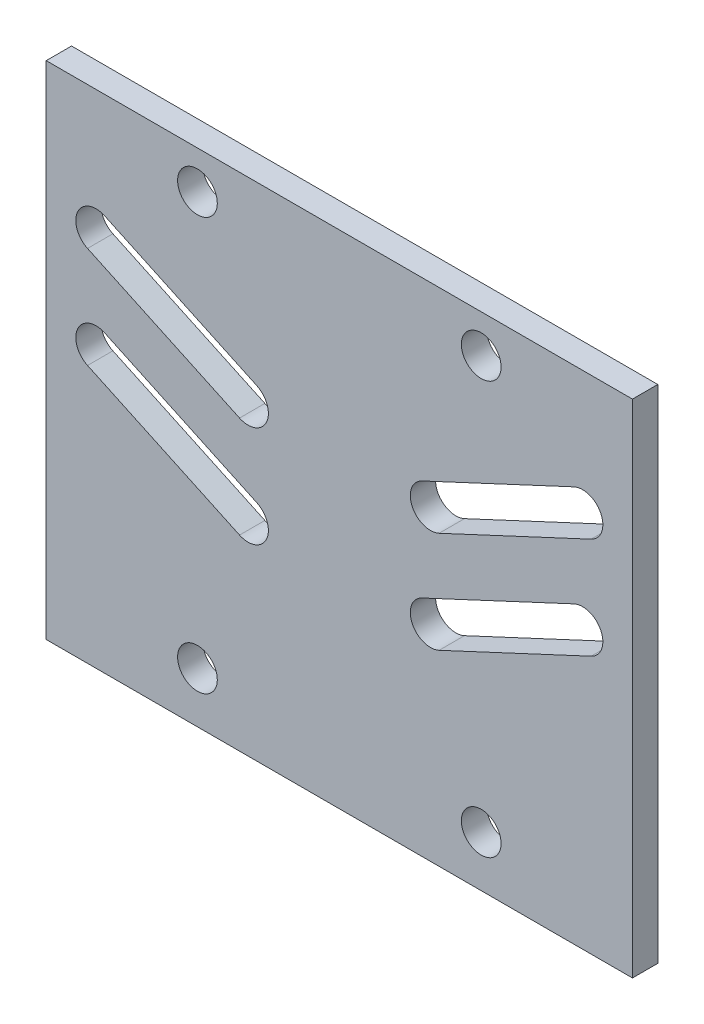
ISO-10303-21;
HEADER;
FILE_DESCRIPTION(('STEP AP214'),'2;1');
FILE_NAME('part.step','',(''),(''),'','','');
FILE_SCHEMA(('AUTOMOTIVE_DESIGN { 1 0 10303 214 1 1 1 1 }'));
ENDSEC;
DATA;
#1=APPLICATION_CONTEXT('core data for automotive mechanical design processes');
#2=APPLICATION_PROTOCOL_DEFINITION('international standard','automotive_design',2000,#1);
#3=PRODUCT_CONTEXT('',#1,'mechanical');
#4=PRODUCT('Part','Part','',(#3));
#5=PRODUCT_RELATED_PRODUCT_CATEGORY('part','',(#4));
#6=PRODUCT_DEFINITION_FORMATION('','',#4);
#7=PRODUCT_DEFINITION_CONTEXT('part definition',#1,'design');
#8=PRODUCT_DEFINITION('design','',#6,#7);
#9=PRODUCT_DEFINITION_SHAPE('','',#8);
#10=(LENGTH_UNIT() NAMED_UNIT(*) SI_UNIT(.MILLI.,.METRE.));
#11=(NAMED_UNIT(*) PLANE_ANGLE_UNIT() SI_UNIT($,.RADIAN.));
#12=(NAMED_UNIT(*) SI_UNIT($,.STERADIAN.) SOLID_ANGLE_UNIT());
#13=UNCERTAINTY_MEASURE_WITH_UNIT(LENGTH_MEASURE(1.E-05),#10,'distance_accuracy_value','');
#14=(GEOMETRIC_REPRESENTATION_CONTEXT(3) GLOBAL_UNCERTAINTY_ASSIGNED_CONTEXT((#13)) GLOBAL_UNIT_ASSIGNED_CONTEXT((#10,
#11,#12)) REPRESENTATION_CONTEXT('',''));
#15=CARTESIAN_POINT('',(0.,0.,0.));
#16=DIRECTION('',(0.,0.,1.));
#17=DIRECTION('',(1.,0.,0.));
#18=AXIS2_PLACEMENT_3D('',#15,#16,#17);
#19=CARTESIAN_POINT('',(0.,0.,47.625));
#20=DIRECTION('',(0.,0.,1.));
#21=DIRECTION('',(1.,0.,0.));
#22=AXIS2_PLACEMENT_3D('',#19,#20,#21);
#23=PLANE('',#22);
#24=CARTESIAN_POINT('',(-17.78,-105.770421270388,47.625));
#25=DIRECTION('',(0.,0.,1.));
#26=DIRECTION('',(1.,0.,0.));
#27=AXIS2_PLACEMENT_3D('',#24,#25,#26);
#28=CIRCLE('',#27,2.4892);
#29=CARTESIAN_POINT('',(-15.2908,-105.770421270388,47.625));
#30=VERTEX_POINT('',#29);
#31=EDGE_CURVE('E609',#30,#30,#28,.T.);
#32=ORIENTED_EDGE('',*,*,#31,.F.);
#33=EDGE_LOOP('',(#32));
#34=FACE_BOUND('',#33,.T.);
#35=CARTESIAN_POINT('',(17.78,-105.770421270388,47.625));
#36=DIRECTION('',(0.,0.,1.));
#37=DIRECTION('',(1.,0.,0.));
#38=AXIS2_PLACEMENT_3D('',#35,#36,#37);
#39=CIRCLE('',#38,2.4892);
#40=CARTESIAN_POINT('',(20.2692,-105.770421270388,47.625));
#41=VERTEX_POINT('',#40);
#42=EDGE_CURVE('E613',#41,#41,#39,.T.);
#43=ORIENTED_EDGE('',*,*,#42,.F.);
#44=EDGE_LOOP('',(#43));
#45=FACE_BOUND('',#44,.T.);
#46=CARTESIAN_POINT('',(17.78,-157.48,47.625));
#47=DIRECTION('',(0.,0.,1.));
#48=DIRECTION('',(1.,0.,0.));
#49=AXIS2_PLACEMENT_3D('',#46,#47,#48);
#50=CIRCLE('',#49,2.4892);
#51=CARTESIAN_POINT('',(20.2692,-157.48,47.625));
#52=VERTEX_POINT('',#51);
#53=EDGE_CURVE('E622',#52,#52,#50,.T.);
#54=ORIENTED_EDGE('',*,*,#53,.F.);
#55=EDGE_LOOP('',(#54));
#56=FACE_BOUND('',#55,.T.);
#57=CARTESIAN_POINT('',(-17.78,-157.48,47.625));
#58=DIRECTION('',(0.,0.,1.));
#59=DIRECTION('',(1.,0.,0.));
#60=AXIS2_PLACEMENT_3D('',#57,#58,#59);
#61=CIRCLE('',#60,2.4892);
#62=CARTESIAN_POINT('',(-15.2908,-157.48,47.625));
#63=VERTEX_POINT('',#62);
#64=EDGE_CURVE('E628',#63,#63,#61,.T.);
#65=ORIENTED_EDGE('',*,*,#64,.F.);
#66=EDGE_LOOP('',(#65));
#67=FACE_BOUND('',#66,.T.);
#68=DIRECTION('',(0.,1.,0.));
#69=VECTOR('',#68,1.);
#70=CARTESIAN_POINT('',(-36.729999946,-101.007921270388,47.625));
#71=LINE('',#70,#69);
#72=CARTESIAN_POINT('',(-36.729999946,-163.83,47.625));
#73=VERTEX_POINT('',#72);
#74=CARTESIAN_POINT('',(-36.729999946,-101.007921270388,47.625));
#75=VERTEX_POINT('',#74);
#76=EDGE_CURVE('E58',#73,#75,#71,.T.);
#77=ORIENTED_EDGE('',*,*,#76,.F.);
#78=DIRECTION('',(1.,0.,0.));
#79=VECTOR('',#78,1.);
#80=CARTESIAN_POINT('',(-36.83,-163.83,47.625));
#81=LINE('',#80,#79);
#82=CARTESIAN_POINT('',(36.729999946,-163.83,47.625));
#83=VERTEX_POINT('',#82);
#84=EDGE_CURVE('E191',#73,#83,#81,.T.);
#85=ORIENTED_EDGE('',*,*,#84,.T.);
#86=DIRECTION('',(0.,-1.,0.));
#87=VECTOR('',#86,1.);
#88=CARTESIAN_POINT('',(36.729999946,-163.83,47.625));
#89=LINE('',#88,#87);
#90=CARTESIAN_POINT('',(36.729999946,-101.007921270388,47.625));
#91=VERTEX_POINT('',#90);
#92=EDGE_CURVE('E630',#91,#83,#89,.T.);
#93=ORIENTED_EDGE('',*,*,#92,.F.);
#94=DIRECTION('',(-1.,0.,0.));
#95=VECTOR('',#94,1.);
#96=CARTESIAN_POINT('',(-36.83,-101.007921270388,47.625));
#97=LINE('',#96,#95);
#98=EDGE_CURVE('E193',#91,#75,#97,.T.);
#99=ORIENTED_EDGE('',*,*,#98,.T.);
#100=EDGE_LOOP('',(#77,#85,#93,#99));
#101=FACE_BOUND('',#100,.T.);
#102=DIRECTION('',(0.90630778703665,-0.422618261740698,0.));
#103=VECTOR('',#102,1.);
#104=CARTESIAN_POINT('',(-31.5534503848214,-118.797919524747,47.625));
#105=LINE('',#104,#103);
#106=CARTESIAN_POINT('',(-31.5534503848214,-118.797919524747,47.625));
#107=VERTEX_POINT('',#106);
#108=CARTESIAN_POINT('',(-12.5034503848214,-127.6810804126,47.625));
#109=VERTEX_POINT('',#108);
#110=EDGE_CURVE('E313',#107,#109,#105,.T.);
#111=ORIENTED_EDGE('',*,*,#110,.F.);
#112=CARTESIAN_POINT('',(-30.48,-116.495897745674,47.625));
#113=DIRECTION('',(0.,0.,1.));
#114=DIRECTION('',(1.,0.,0.));
#115=AXIS2_PLACEMENT_3D('',#112,#113,#114);
#116=CIRCLE('',#115,2.54000000000005);
#117=CARTESIAN_POINT('',(-29.4065496151786,-114.193875966601,47.625));
#118=VERTEX_POINT('',#117);
#119=EDGE_CURVE('E311',#118,#107,#116,.T.);
#120=ORIENTED_EDGE('',*,*,#119,.F.);
#121=DIRECTION('',(-0.906307787036649,0.422618261740702,0.));
#122=VECTOR('',#121,1.);
#123=CARTESIAN_POINT('',(-29.4065496151786,-114.193875966601,47.625));
#124=LINE('',#123,#122);
#125=CARTESIAN_POINT('',(-10.3565496151786,-123.077036854454,47.625));
#126=VERTEX_POINT('',#125);
#127=EDGE_CURVE('E319',#126,#118,#124,.T.);
#128=ORIENTED_EDGE('',*,*,#127,.F.);
#129=CARTESIAN_POINT('',(-11.43,-125.379058633527,47.625));
#130=DIRECTION('',(0.,0.,1.));
#131=DIRECTION('',(1.,0.,0.));
#132=AXIS2_PLACEMENT_3D('',#129,#130,#131);
#133=CIRCLE('',#132,2.54000000000001);
#134=EDGE_CURVE('E316',#109,#126,#133,.T.);
#135=ORIENTED_EDGE('',*,*,#134,.F.);
#136=EDGE_LOOP('',(#111,#120,#128,#135));
#137=FACE_BOUND('',#136,.T.);
#138=DIRECTION('',(0.906307787036648,-0.422618261740703,0.));
#139=VECTOR('',#138,1.);
#140=CARTESIAN_POINT('',(-31.5534503848213,-131.497919524747,47.625));
#141=LINE('',#140,#139);
#142=CARTESIAN_POINT('',(-31.5534503848213,-131.497919524747,47.625));
#143=VERTEX_POINT('',#142);
#144=CARTESIAN_POINT('',(-12.5034503848213,-140.3810804126,47.625));
#145=VERTEX_POINT('',#144);
#146=EDGE_CURVE('E282',#143,#145,#141,.T.);
#147=ORIENTED_EDGE('',*,*,#146,.F.);
#148=CARTESIAN_POINT('',(-30.48,-129.195897745674,47.625));
#149=DIRECTION('',(0.,0.,1.));
#150=DIRECTION('',(1.,0.,0.));
#151=AXIS2_PLACEMENT_3D('',#148,#149,#150);
#152=CIRCLE('',#151,2.53999999999992);
#153=CARTESIAN_POINT('',(-29.4065496151786,-126.893875966601,47.625));
#154=VERTEX_POINT('',#153);
#155=EDGE_CURVE('E280',#154,#143,#152,.T.);
#156=ORIENTED_EDGE('',*,*,#155,.F.);
#157=DIRECTION('',(-0.906307787036649,0.422618261740701,0.));
#158=VECTOR('',#157,1.);
#159=CARTESIAN_POINT('',(-29.4065496151786,-126.893875966601,47.625));
#160=LINE('',#159,#158);
#161=CARTESIAN_POINT('',(-10.3565496151786,-135.777036854454,47.625));
#162=VERTEX_POINT('',#161);
#163=EDGE_CURVE('E288',#162,#154,#160,.T.);
#164=ORIENTED_EDGE('',*,*,#163,.F.);
#165=CARTESIAN_POINT('',(-11.43,-138.079058633527,47.625));
#166=DIRECTION('',(0.,0.,1.));
#167=DIRECTION('',(1.,0.,0.));
#168=AXIS2_PLACEMENT_3D('',#165,#166,#167);
#169=CIRCLE('',#168,2.53999999999994);
#170=EDGE_CURVE('E285',#145,#162,#169,.T.);
#171=ORIENTED_EDGE('',*,*,#170,.F.);
#172=EDGE_LOOP('',(#147,#156,#164,#171));
#173=FACE_BOUND('',#172,.T.);
#174=DIRECTION('',(-0.906307787036651,-0.422618261740697,0.));
#175=VECTOR('',#174,1.);
#176=CARTESIAN_POINT('',(29.4065496151787,-126.893875966601,47.625));
#177=LINE('',#176,#175);
#178=CARTESIAN_POINT('',(29.4065496151787,-126.893875966601,47.625));
#179=VERTEX_POINT('',#178);
#180=CARTESIAN_POINT('',(10.3565496151786,-135.777036854454,47.625));
#181=VERTEX_POINT('',#180);
#182=EDGE_CURVE('E251',#179,#181,#177,.T.);
#183=ORIENTED_EDGE('',*,*,#182,.F.);
#184=CARTESIAN_POINT('',(30.48,-129.195897745674,47.625));
#185=DIRECTION('',(0.,0.,1.));
#186=DIRECTION('',(-1.,0.,0.));
#187=AXIS2_PLACEMENT_3D('',#184,#185,#186);
#188=CIRCLE('',#187,2.53999999999992);
#189=CARTESIAN_POINT('',(31.5534503848213,-131.497919524747,47.625));
#190=VERTEX_POINT('',#189);
#191=EDGE_CURVE('E249',#190,#179,#188,.T.);
#192=ORIENTED_EDGE('',*,*,#191,.F.);
#193=DIRECTION('',(0.906307787036648,0.422618261740703,0.));
#194=VECTOR('',#193,1.);
#195=CARTESIAN_POINT('',(31.5534503848213,-131.497919524747,47.625));
#196=LINE('',#195,#194);
#197=CARTESIAN_POINT('',(12.5034503848214,-140.3810804126,47.625));
#198=VERTEX_POINT('',#197);
#199=EDGE_CURVE('E257',#198,#190,#196,.T.);
#200=ORIENTED_EDGE('',*,*,#199,.F.);
#201=CARTESIAN_POINT('',(11.43,-138.079058633527,47.625));
#202=DIRECTION('',(0.,0.,1.));
#203=DIRECTION('',(-1.,0.,0.));
#204=AXIS2_PLACEMENT_3D('',#201,#202,#203);
#205=CIRCLE('',#204,2.53999999999998);
#206=EDGE_CURVE('E254',#181,#198,#205,.T.);
#207=ORIENTED_EDGE('',*,*,#206,.F.);
#208=EDGE_LOOP('',(#183,#192,#200,#207));
#209=FACE_BOUND('',#208,.T.);
#210=DIRECTION('',(-0.906307787036649,-0.422618261740702,0.));
#211=VECTOR('',#210,1.);
#212=CARTESIAN_POINT('',(29.4065496151786,-114.193875966601,47.625));
#213=LINE('',#212,#211);
#214=CARTESIAN_POINT('',(29.4065496151786,-114.193875966601,47.625));
#215=VERTEX_POINT('',#214);
#216=CARTESIAN_POINT('',(10.3565496151786,-123.077036854454,47.625));
#217=VERTEX_POINT('',#216);
#218=EDGE_CURVE('E223',#215,#217,#213,.T.);
#219=ORIENTED_EDGE('',*,*,#218,.F.);
#220=CARTESIAN_POINT('',(30.48,-116.495897745674,47.625));
#221=DIRECTION('',(0.,0.,1.));
#222=DIRECTION('',(-1.,0.,0.));
#223=AXIS2_PLACEMENT_3D('',#220,#221,#222);
#224=CIRCLE('',#223,2.54000000000005);
#225=CARTESIAN_POINT('',(31.5534503848214,-118.797919524747,47.625));
#226=VERTEX_POINT('',#225);
#227=EDGE_CURVE('E221',#226,#215,#224,.T.);
#228=ORIENTED_EDGE('',*,*,#227,.F.);
#229=DIRECTION('',(0.90630778703665,0.422618261740698,0.));
#230=VECTOR('',#229,1.);
#231=CARTESIAN_POINT('',(31.5534503848214,-118.797919524747,47.625));
#232=LINE('',#231,#230);
#233=CARTESIAN_POINT('',(12.5034503848214,-127.6810804126,47.625));
#234=VERTEX_POINT('',#233);
#235=EDGE_CURVE('E229',#234,#226,#232,.T.);
#236=ORIENTED_EDGE('',*,*,#235,.F.);
#237=CARTESIAN_POINT('',(11.43,-125.379058633527,47.625));
#238=DIRECTION('',(0.,0.,1.));
#239=DIRECTION('',(-1.,0.,0.));
#240=AXIS2_PLACEMENT_3D('',#237,#238,#239);
#241=CIRCLE('',#240,2.54000000000001);
#242=EDGE_CURVE('E226',#217,#234,#241,.T.);
#243=ORIENTED_EDGE('',*,*,#242,.F.);
#244=EDGE_LOOP('',(#219,#228,#236,#243));
#245=FACE_BOUND('',#244,.T.);
#246=ADVANCED_FACE('F43',(#34,#45,#56,#67,#101,#137,#173,#209,#245),#23,.T.);
#247=CARTESIAN_POINT('',(0.,0.,44.45));
#248=DIRECTION('',(0.,0.,1.));
#249=DIRECTION('',(1.,0.,0.));
#250=AXIS2_PLACEMENT_3D('',#247,#248,#249);
#251=PLANE('',#250);
#252=CARTESIAN_POINT('',(-17.78,-105.770421270388,44.45));
#253=DIRECTION('',(0.,0.,1.));
#254=DIRECTION('',(1.,0.,0.));
#255=AXIS2_PLACEMENT_3D('',#252,#253,#254);
#256=CIRCLE('',#255,2.4892);
#257=CARTESIAN_POINT('',(-15.2908,-105.770421270388,44.45));
#258=VERTEX_POINT('',#257);
#259=EDGE_CURVE('E607',#258,#258,#256,.T.);
#260=ORIENTED_EDGE('',*,*,#259,.T.);
#261=EDGE_LOOP('',(#260));
#262=FACE_BOUND('',#261,.T.);
#263=CARTESIAN_POINT('',(17.78,-105.770421270388,44.45));
#264=DIRECTION('',(0.,0.,1.));
#265=DIRECTION('',(1.,0.,0.));
#266=AXIS2_PLACEMENT_3D('',#263,#264,#265);
#267=CIRCLE('',#266,2.4892);
#268=CARTESIAN_POINT('',(20.2692,-105.770421270388,44.45));
#269=VERTEX_POINT('',#268);
#270=EDGE_CURVE('E610',#269,#269,#267,.T.);
#271=ORIENTED_EDGE('',*,*,#270,.T.);
#272=EDGE_LOOP('',(#271));
#273=FACE_BOUND('',#272,.T.);
#274=CARTESIAN_POINT('',(17.78,-157.48,44.45));
#275=DIRECTION('',(0.,0.,1.));
#276=DIRECTION('',(1.,0.,0.));
#277=AXIS2_PLACEMENT_3D('',#274,#275,#276);
#278=CIRCLE('',#277,2.4892);
#279=CARTESIAN_POINT('',(20.2692,-157.48,44.45));
#280=VERTEX_POINT('',#279);
#281=EDGE_CURVE('E619',#280,#280,#278,.T.);
#282=ORIENTED_EDGE('',*,*,#281,.T.);
#283=EDGE_LOOP('',(#282));
#284=FACE_BOUND('',#283,.T.);
#285=CARTESIAN_POINT('',(-17.78,-157.48,44.45));
#286=DIRECTION('',(0.,0.,1.));
#287=DIRECTION('',(1.,0.,0.));
#288=AXIS2_PLACEMENT_3D('',#285,#286,#287);
#289=CIRCLE('',#288,2.4892);
#290=CARTESIAN_POINT('',(-15.2908,-157.48,44.45));
#291=VERTEX_POINT('',#290);
#292=EDGE_CURVE('E625',#291,#291,#289,.T.);
#293=ORIENTED_EDGE('',*,*,#292,.T.);
#294=EDGE_LOOP('',(#293));
#295=FACE_BOUND('',#294,.T.);
#296=CARTESIAN_POINT('',(30.48,-129.195897745674,44.45));
#297=DIRECTION('',(0.,0.,1.));
#298=DIRECTION('',(-1.,0.,0.));
#299=AXIS2_PLACEMENT_3D('',#296,#297,#298);
#300=CIRCLE('',#299,2.53999999999992);
#301=CARTESIAN_POINT('',(31.5534503848213,-131.497919524747,44.45));
#302=VERTEX_POINT('',#301);
#303=CARTESIAN_POINT('',(29.4065496151787,-126.893875966601,44.45));
#304=VERTEX_POINT('',#303);
#305=EDGE_CURVE('E248',#302,#304,#300,.T.);
#306=ORIENTED_EDGE('',*,*,#305,.T.);
#307=DIRECTION('',(-0.906307787036651,-0.422618261740697,0.));
#308=VECTOR('',#307,1.);
#309=CARTESIAN_POINT('',(29.4065496151787,-126.893875966601,44.45));
#310=LINE('',#309,#308);
#311=CARTESIAN_POINT('',(10.3565496151786,-135.777036854454,44.45));
#312=VERTEX_POINT('',#311);
#313=EDGE_CURVE('E262',#304,#312,#310,.T.);
#314=ORIENTED_EDGE('',*,*,#313,.T.);
#315=CARTESIAN_POINT('',(11.43,-138.079058633527,44.45));
#316=DIRECTION('',(0.,0.,1.));
#317=DIRECTION('',(-1.,0.,0.));
#318=AXIS2_PLACEMENT_3D('',#315,#316,#317);
#319=CIRCLE('',#318,2.53999999999998);
#320=CARTESIAN_POINT('',(12.5034503848214,-140.3810804126,44.45));
#321=VERTEX_POINT('',#320);
#322=EDGE_CURVE('E265',#312,#321,#319,.T.);
#323=ORIENTED_EDGE('',*,*,#322,.T.);
#324=DIRECTION('',(0.906307787036648,0.422618261740703,0.));
#325=VECTOR('',#324,1.);
#326=CARTESIAN_POINT('',(31.5534503848213,-131.497919524747,44.45));
#327=LINE('',#326,#325);
#328=EDGE_CURVE('E252',#321,#302,#327,.T.);
#329=ORIENTED_EDGE('',*,*,#328,.T.);
#330=EDGE_LOOP('',(#306,#314,#323,#329));
#331=FACE_BOUND('',#330,.T.);
#332=CARTESIAN_POINT('',(-30.48,-116.495897745674,44.45));
#333=DIRECTION('',(0.,0.,1.));
#334=DIRECTION('',(1.,0.,0.));
#335=AXIS2_PLACEMENT_3D('',#332,#333,#334);
#336=CIRCLE('',#335,2.54000000000005);
#337=CARTESIAN_POINT('',(-29.4065496151786,-114.193875966601,44.45));
#338=VERTEX_POINT('',#337);
#339=CARTESIAN_POINT('',(-31.5534503848214,-118.797919524747,44.45));
#340=VERTEX_POINT('',#339);
#341=EDGE_CURVE('E310',#338,#340,#336,.T.);
#342=ORIENTED_EDGE('',*,*,#341,.T.);
#343=DIRECTION('',(0.90630778703665,-0.422618261740698,0.));
#344=VECTOR('',#343,1.);
#345=CARTESIAN_POINT('',(-31.5534503848214,-118.797919524747,44.45));
#346=LINE('',#345,#344);
#347=CARTESIAN_POINT('',(-12.5034503848214,-127.6810804126,44.45));
#348=VERTEX_POINT('',#347);
#349=EDGE_CURVE('E324',#340,#348,#346,.T.);
#350=ORIENTED_EDGE('',*,*,#349,.T.);
#351=CARTESIAN_POINT('',(-11.43,-125.379058633527,44.45));
#352=DIRECTION('',(0.,0.,1.));
#353=DIRECTION('',(1.,0.,0.));
#354=AXIS2_PLACEMENT_3D('',#351,#352,#353);
#355=CIRCLE('',#354,2.54000000000001);
#356=CARTESIAN_POINT('',(-10.3565496151786,-123.077036854454,44.45));
#357=VERTEX_POINT('',#356);
#358=EDGE_CURVE('E327',#348,#357,#355,.T.);
#359=ORIENTED_EDGE('',*,*,#358,.T.);
#360=DIRECTION('',(-0.906307787036649,0.422618261740702,0.));
#361=VECTOR('',#360,1.);
#362=CARTESIAN_POINT('',(-29.4065496151786,-114.193875966601,44.45));
#363=LINE('',#362,#361);
#364=EDGE_CURVE('E314',#357,#338,#363,.T.);
#365=ORIENTED_EDGE('',*,*,#364,.T.);
#366=EDGE_LOOP('',(#342,#350,#359,#365));
#367=FACE_BOUND('',#366,.T.);
#368=DIRECTION('',(1.,0.,0.));
#369=VECTOR('',#368,1.);
#370=CARTESIAN_POINT('',(15.875,-163.83,44.45));
#371=LINE('',#370,#369);
#372=CARTESIAN_POINT('',(-36.729999946,-163.83,44.45));
#373=VERTEX_POINT('',#372);
#374=CARTESIAN_POINT('',(36.729999946,-163.83,44.45));
#375=VERTEX_POINT('',#374);
#376=EDGE_CURVE('E201',#373,#375,#371,.T.);
#377=ORIENTED_EDGE('',*,*,#376,.F.);
#378=DIRECTION('',(0.,1.,0.));
#379=VECTOR('',#378,1.);
#380=CARTESIAN_POINT('',(-36.729999946,0.,44.45));
#381=LINE('',#380,#379);
#382=CARTESIAN_POINT('',(-36.729999946,-101.007921270388,44.45));
#383=VERTEX_POINT('',#382);
#384=EDGE_CURVE('E180',#373,#383,#381,.T.);
#385=ORIENTED_EDGE('',*,*,#384,.T.);
#386=DIRECTION('',(-1.,0.,0.));
#387=VECTOR('',#386,1.);
#388=CARTESIAN_POINT('',(-36.83,-101.007921270388,44.45));
#389=LINE('',#388,#387);
#390=CARTESIAN_POINT('',(36.729999946,-101.007921270388,44.45));
#391=VERTEX_POINT('',#390);
#392=EDGE_CURVE('E197',#391,#383,#389,.T.);
#393=ORIENTED_EDGE('',*,*,#392,.F.);
#394=DIRECTION('',(0.,-1.,0.));
#395=VECTOR('',#394,1.);
#396=CARTESIAN_POINT('',(36.729999946,0.,44.45));
#397=LINE('',#396,#395);
#398=EDGE_CURVE('E65',#391,#375,#397,.T.);
#399=ORIENTED_EDGE('',*,*,#398,.T.);
#400=EDGE_LOOP('',(#377,#385,#393,#399));
#401=FACE_BOUND('',#400,.T.);
#402=CARTESIAN_POINT('',(-30.48,-129.195897745674,44.45));
#403=DIRECTION('',(0.,0.,1.));
#404=DIRECTION('',(1.,0.,0.));
#405=AXIS2_PLACEMENT_3D('',#402,#403,#404);
#406=CIRCLE('',#405,2.53999999999992);
#407=CARTESIAN_POINT('',(-29.4065496151786,-126.893875966601,44.45));
#408=VERTEX_POINT('',#407);
#409=CARTESIAN_POINT('',(-31.5534503848213,-131.497919524747,44.45));
#410=VERTEX_POINT('',#409);
#411=EDGE_CURVE('E279',#408,#410,#406,.T.);
#412=ORIENTED_EDGE('',*,*,#411,.T.);
#413=DIRECTION('',(0.906307787036648,-0.422618261740703,0.));
#414=VECTOR('',#413,1.);
#415=CARTESIAN_POINT('',(-31.5534503848213,-131.497919524747,44.45));
#416=LINE('',#415,#414);
#417=CARTESIAN_POINT('',(-12.5034503848213,-140.3810804126,44.45));
#418=VERTEX_POINT('',#417);
#419=EDGE_CURVE('E293',#410,#418,#416,.T.);
#420=ORIENTED_EDGE('',*,*,#419,.T.);
#421=CARTESIAN_POINT('',(-11.43,-138.079058633527,44.45));
#422=DIRECTION('',(0.,0.,1.));
#423=DIRECTION('',(1.,0.,0.));
#424=AXIS2_PLACEMENT_3D('',#421,#422,#423);
#425=CIRCLE('',#424,2.53999999999994);
#426=CARTESIAN_POINT('',(-10.3565496151786,-135.777036854454,44.45));
#427=VERTEX_POINT('',#426);
#428=EDGE_CURVE('E296',#418,#427,#425,.T.);
#429=ORIENTED_EDGE('',*,*,#428,.T.);
#430=DIRECTION('',(-0.906307787036649,0.422618261740701,0.));
#431=VECTOR('',#430,1.);
#432=CARTESIAN_POINT('',(-29.4065496151786,-126.893875966601,44.45));
#433=LINE('',#432,#431);
#434=EDGE_CURVE('E283',#427,#408,#433,.T.);
#435=ORIENTED_EDGE('',*,*,#434,.T.);
#436=EDGE_LOOP('',(#412,#420,#429,#435));
#437=FACE_BOUND('',#436,.T.);
#438=CARTESIAN_POINT('',(30.48,-116.495897745674,44.45));
#439=DIRECTION('',(0.,0.,1.));
#440=DIRECTION('',(-1.,0.,0.));
#441=AXIS2_PLACEMENT_3D('',#438,#439,#440);
#442=CIRCLE('',#441,2.54000000000005);
#443=CARTESIAN_POINT('',(31.5534503848214,-118.797919524747,44.45));
#444=VERTEX_POINT('',#443);
#445=CARTESIAN_POINT('',(29.4065496151786,-114.193875966601,44.45));
#446=VERTEX_POINT('',#445);
#447=EDGE_CURVE('E213',#444,#446,#442,.T.);
#448=ORIENTED_EDGE('',*,*,#447,.T.);
#449=DIRECTION('',(-0.906307787036649,-0.422618261740702,0.));
#450=VECTOR('',#449,1.);
#451=CARTESIAN_POINT('',(29.4065496151786,-114.193875966601,44.45));
#452=LINE('',#451,#450);
#453=CARTESIAN_POINT('',(10.3565496151786,-123.077036854454,44.45));
#454=VERTEX_POINT('',#453);
#455=EDGE_CURVE('E216',#446,#454,#452,.T.);
#456=ORIENTED_EDGE('',*,*,#455,.T.);
#457=CARTESIAN_POINT('',(11.43,-125.379058633527,44.45));
#458=DIRECTION('',(0.,0.,1.));
#459=DIRECTION('',(-1.,0.,0.));
#460=AXIS2_PLACEMENT_3D('',#457,#458,#459);
#461=CIRCLE('',#460,2.54000000000001);
#462=CARTESIAN_POINT('',(12.5034503848214,-127.6810804126,44.45));
#463=VERTEX_POINT('',#462);
#464=EDGE_CURVE('E234',#454,#463,#461,.T.);
#465=ORIENTED_EDGE('',*,*,#464,.T.);
#466=DIRECTION('',(0.90630778703665,0.422618261740698,0.));
#467=VECTOR('',#466,1.);
#468=CARTESIAN_POINT('',(31.5534503848214,-118.797919524747,44.45));
#469=LINE('',#468,#467);
#470=EDGE_CURVE('E224',#463,#444,#469,.T.);
#471=ORIENTED_EDGE('',*,*,#470,.T.);
#472=EDGE_LOOP('',(#448,#456,#465,#471));
#473=FACE_BOUND('',#472,.T.);
#474=ADVANCED_FACE('F211',(#262,#273,#284,#295,#331,#367,#401,#437,#473),#251,.F.);
#475=CARTESIAN_POINT('',(15.875,-163.83,47.625));
#476=DIRECTION('',(0.,1.,0.));
#477=DIRECTION('',(0.,0.,1.));
#478=AXIS2_PLACEMENT_3D('',#475,#476,#477);
#479=PLANE('',#478);
#480=ORIENTED_EDGE('',*,*,#84,.F.);
#481=DIRECTION('',(0.,0.,1.));
#482=VECTOR('',#481,1.);
#483=CARTESIAN_POINT('',(-36.729999946,-163.83,-3.17500000000004));
#484=LINE('',#483,#482);
#485=EDGE_CURVE('E177',#373,#73,#484,.T.);
#486=ORIENTED_EDGE('',*,*,#485,.F.);
#487=ORIENTED_EDGE('',*,*,#376,.T.);
#488=DIRECTION('',(0.,0.,1.));
#489=VECTOR('',#488,1.);
#490=CARTESIAN_POINT('',(36.729999946,-163.83,-3.17500000000004));
#491=LINE('',#490,#489);
#492=EDGE_CURVE('E194',#375,#83,#491,.T.);
#493=ORIENTED_EDGE('',*,*,#492,.T.);
#494=EDGE_LOOP('',(#480,#486,#487,#493));
#495=FACE_BOUND('',#494,.T.);
#496=ADVANCED_FACE('F45',(#495),#479,.F.);
#497=CARTESIAN_POINT('',(-36.83,-101.007921270388,47.625));
#498=DIRECTION('',(0.,-1.,0.));
#499=DIRECTION('',(0.,0.,-1.));
#500=AXIS2_PLACEMENT_3D('',#497,#498,#499);
#501=PLANE('',#500);
#502=ORIENTED_EDGE('',*,*,#392,.T.);
#503=DIRECTION('',(0.,0.,1.));
#504=VECTOR('',#503,1.);
#505=CARTESIAN_POINT('',(-36.729999946,-101.007921270388,47.625));
#506=LINE('',#505,#504);
#507=EDGE_CURVE('E11',#383,#75,#506,.T.);
#508=ORIENTED_EDGE('',*,*,#507,.T.);
#509=ORIENTED_EDGE('',*,*,#98,.F.);
#510=DIRECTION('',(0.,0.,-1.));
#511=VECTOR('',#510,1.);
#512=CARTESIAN_POINT('',(36.729999946,-101.007921270388,47.625));
#513=LINE('',#512,#511);
#514=EDGE_CURVE('E51',#91,#391,#513,.T.);
#515=ORIENTED_EDGE('',*,*,#514,.T.);
#516=EDGE_LOOP('',(#502,#508,#509,#515));
#517=FACE_BOUND('',#516,.T.);
#518=ADVANCED_FACE('F209',(#517),#501,.F.);
#519=CARTESIAN_POINT('',(-30.48,-116.495897745674,47.625));
#520=DIRECTION('',(0.,0.,-1.));
#521=DIRECTION('',(-1.,0.,0.));
#522=AXIS2_PLACEMENT_3D('',#519,#520,#521);
#523=CYLINDRICAL_SURFACE('',#522,2.54000000000005);
#524=ORIENTED_EDGE('',*,*,#341,.F.);
#525=DIRECTION('',(0.,0.,-1.));
#526=VECTOR('',#525,1.);
#527=CARTESIAN_POINT('',(-29.4065496151786,-114.193875966601,47.625));
#528=LINE('',#527,#526);
#529=EDGE_CURVE('E321',#118,#338,#528,.T.);
#530=ORIENTED_EDGE('',*,*,#529,.F.);
#531=ORIENTED_EDGE('',*,*,#119,.T.);
#532=DIRECTION('',(0.,0.,-1.));
#533=VECTOR('',#532,1.);
#534=CARTESIAN_POINT('',(-31.5534503848214,-118.797919524747,47.625));
#535=LINE('',#534,#533);
#536=EDGE_CURVE('E204',#107,#340,#535,.T.);
#537=ORIENTED_EDGE('',*,*,#536,.T.);
#538=EDGE_LOOP('',(#524,#530,#531,#537));
#539=FACE_BOUND('',#538,.T.);
#540=ADVANCED_FACE('F342',(#539),#523,.F.);
#541=CARTESIAN_POINT('',(-31.5534503848214,-118.797919524747,47.625));
#542=DIRECTION('',(0.422618261740698,0.90630778703665,0.));
#543=DIRECTION('',(-0.90630778703665,0.422618261740698,0.));
#544=AXIS2_PLACEMENT_3D('',#541,#542,#543);
#545=PLANE('',#544);
#546=ORIENTED_EDGE('',*,*,#349,.F.);
#547=ORIENTED_EDGE('',*,*,#536,.F.);
#548=ORIENTED_EDGE('',*,*,#110,.T.);
#549=DIRECTION('',(0.,0.,-1.));
#550=VECTOR('',#549,1.);
#551=CARTESIAN_POINT('',(-12.5034503848214,-127.6810804126,47.625));
#552=LINE('',#551,#550);
#553=EDGE_CURVE('E335',#109,#348,#552,.T.);
#554=ORIENTED_EDGE('',*,*,#553,.T.);
#555=EDGE_LOOP('',(#546,#547,#548,#554));
#556=FACE_BOUND('',#555,.T.);
#557=ADVANCED_FACE('F353',(#556),#545,.T.);
#558=CARTESIAN_POINT('',(-11.43,-125.379058633527,47.625));
#559=DIRECTION('',(0.,0.,-1.));
#560=DIRECTION('',(-1.,0.,0.));
#561=AXIS2_PLACEMENT_3D('',#558,#559,#560);
#562=CYLINDRICAL_SURFACE('',#561,2.54000000000001);
#563=ORIENTED_EDGE('',*,*,#358,.F.);
#564=ORIENTED_EDGE('',*,*,#553,.F.);
#565=ORIENTED_EDGE('',*,*,#134,.T.);
#566=DIRECTION('',(0.,0.,-1.));
#567=VECTOR('',#566,1.);
#568=CARTESIAN_POINT('',(-10.3565496151786,-123.077036854454,47.625));
#569=LINE('',#568,#567);
#570=EDGE_CURVE('E334',#126,#357,#569,.T.);
#571=ORIENTED_EDGE('',*,*,#570,.T.);
#572=EDGE_LOOP('',(#563,#564,#565,#571));
#573=FACE_BOUND('',#572,.T.);
#574=ADVANCED_FACE('F355',(#573),#562,.F.);
#575=CARTESIAN_POINT('',(-29.4065496151786,-114.193875966601,47.625));
#576=DIRECTION('',(-0.422618261740702,-0.906307787036649,0.));
#577=DIRECTION('',(0.906307787036649,-0.422618261740702,0.));
#578=AXIS2_PLACEMENT_3D('',#575,#576,#577);
#579=PLANE('',#578);
#580=ORIENTED_EDGE('',*,*,#364,.F.);
#581=ORIENTED_EDGE('',*,*,#570,.F.);
#582=ORIENTED_EDGE('',*,*,#127,.T.);
#583=ORIENTED_EDGE('',*,*,#529,.T.);
#584=EDGE_LOOP('',(#580,#581,#582,#583));
#585=FACE_BOUND('',#584,.T.);
#586=ADVANCED_FACE('F349',(#585),#579,.T.);
#587=CARTESIAN_POINT('',(-30.48,-129.195897745674,47.625));
#588=DIRECTION('',(0.,0.,-1.));
#589=DIRECTION('',(-1.,0.,0.));
#590=AXIS2_PLACEMENT_3D('',#587,#588,#589);
#591=CYLINDRICAL_SURFACE('',#590,2.53999999999992);
#592=ORIENTED_EDGE('',*,*,#411,.F.);
#593=DIRECTION('',(0.,0.,-1.));
#594=VECTOR('',#593,1.);
#595=CARTESIAN_POINT('',(-29.4065496151786,-126.893875966601,47.625));
#596=LINE('',#595,#594);
#597=EDGE_CURVE('E290',#154,#408,#596,.T.);
#598=ORIENTED_EDGE('',*,*,#597,.F.);
#599=ORIENTED_EDGE('',*,*,#155,.T.);
#600=DIRECTION('',(0.,0.,-1.));
#601=VECTOR('',#600,1.);
#602=CARTESIAN_POINT('',(-31.5534503848213,-131.497919524747,47.625));
#603=LINE('',#602,#601);
#604=EDGE_CURVE('E307',#143,#410,#603,.T.);
#605=ORIENTED_EDGE('',*,*,#604,.T.);
#606=EDGE_LOOP('',(#592,#598,#599,#605));
#607=FACE_BOUND('',#606,.T.);
#608=ADVANCED_FACE('F363',(#607),#591,.F.);
#609=CARTESIAN_POINT('',(-31.5534503848213,-131.497919524747,47.625));
#610=DIRECTION('',(0.422618261740703,0.906307787036648,0.));
#611=DIRECTION('',(-0.906307787036649,0.422618261740703,0.));
#612=AXIS2_PLACEMENT_3D('',#609,#610,#611);
#613=PLANE('',#612);
#614=ORIENTED_EDGE('',*,*,#419,.F.);
#615=ORIENTED_EDGE('',*,*,#604,.F.);
#616=ORIENTED_EDGE('',*,*,#146,.T.);
#617=DIRECTION('',(0.,0.,-1.));
#618=VECTOR('',#617,1.);
#619=CARTESIAN_POINT('',(-12.5034503848213,-140.3810804126,47.625));
#620=LINE('',#619,#618);
#621=EDGE_CURVE('E305',#145,#418,#620,.T.);
#622=ORIENTED_EDGE('',*,*,#621,.T.);
#623=EDGE_LOOP('',(#614,#615,#616,#622));
#624=FACE_BOUND('',#623,.T.);
#625=ADVANCED_FACE('F433',(#624),#613,.T.);
#626=CARTESIAN_POINT('',(-11.43,-138.079058633527,47.625));
#627=DIRECTION('',(0.,0.,-1.));
#628=DIRECTION('',(-1.,0.,0.));
#629=AXIS2_PLACEMENT_3D('',#626,#627,#628);
#630=CYLINDRICAL_SURFACE('',#629,2.53999999999994);
#631=ORIENTED_EDGE('',*,*,#428,.F.);
#632=ORIENTED_EDGE('',*,*,#621,.F.);
#633=ORIENTED_EDGE('',*,*,#170,.T.);
#634=DIRECTION('',(0.,0.,-1.));
#635=VECTOR('',#634,1.);
#636=CARTESIAN_POINT('',(-10.3565496151786,-135.777036854454,47.625));
#637=LINE('',#636,#635);
#638=EDGE_CURVE('E303',#162,#427,#637,.T.);
#639=ORIENTED_EDGE('',*,*,#638,.T.);
#640=EDGE_LOOP('',(#631,#632,#633,#639));
#641=FACE_BOUND('',#640,.T.);
#642=ADVANCED_FACE('F443',(#641),#630,.F.);
#643=CARTESIAN_POINT('',(-29.4065496151786,-126.893875966601,47.625));
#644=DIRECTION('',(-0.422618261740701,-0.906307787036649,0.));
#645=DIRECTION('',(0.906307787036649,-0.422618261740701,0.));
#646=AXIS2_PLACEMENT_3D('',#643,#644,#645);
#647=PLANE('',#646);
#648=ORIENTED_EDGE('',*,*,#434,.F.);
#649=ORIENTED_EDGE('',*,*,#638,.F.);
#650=ORIENTED_EDGE('',*,*,#163,.T.);
#651=ORIENTED_EDGE('',*,*,#597,.T.);
#652=EDGE_LOOP('',(#648,#649,#650,#651));
#653=FACE_BOUND('',#652,.T.);
#654=ADVANCED_FACE('F452',(#653),#647,.T.);
#655=CARTESIAN_POINT('',(30.48,-129.195897745674,47.625));
#656=DIRECTION('',(0.,0.,-1.));
#657=DIRECTION('',(-1.,0.,0.));
#658=AXIS2_PLACEMENT_3D('',#655,#656,#657);
#659=CYLINDRICAL_SURFACE('',#658,2.53999999999992);
#660=ORIENTED_EDGE('',*,*,#305,.F.);
#661=DIRECTION('',(0.,0.,-1.));
#662=VECTOR('',#661,1.);
#663=CARTESIAN_POINT('',(31.5534503848213,-131.497919524747,47.625));
#664=LINE('',#663,#662);
#665=EDGE_CURVE('E259',#190,#302,#664,.T.);
#666=ORIENTED_EDGE('',*,*,#665,.F.);
#667=ORIENTED_EDGE('',*,*,#191,.T.);
#668=DIRECTION('',(0.,0.,-1.));
#669=VECTOR('',#668,1.);
#670=CARTESIAN_POINT('',(29.4065496151787,-126.893875966601,47.625));
#671=LINE('',#670,#669);
#672=EDGE_CURVE('E276',#179,#304,#671,.T.);
#673=ORIENTED_EDGE('',*,*,#672,.T.);
#674=EDGE_LOOP('',(#660,#666,#667,#673));
#675=FACE_BOUND('',#674,.T.);
#676=ADVANCED_FACE('F461',(#675),#659,.F.);
#677=CARTESIAN_POINT('',(29.4065496151787,-126.893875966601,47.625));
#678=DIRECTION('',(0.422618261740697,-0.906307787036651,0.));
#679=DIRECTION('',(0.906307787036651,0.422618261740697,0.));
#680=AXIS2_PLACEMENT_3D('',#677,#678,#679);
#681=PLANE('',#680);
#682=ORIENTED_EDGE('',*,*,#313,.F.);
#683=ORIENTED_EDGE('',*,*,#672,.F.);
#684=ORIENTED_EDGE('',*,*,#182,.T.);
#685=DIRECTION('',(0.,0.,-1.));
#686=VECTOR('',#685,1.);
#687=CARTESIAN_POINT('',(10.3565496151786,-135.777036854454,47.625));
#688=LINE('',#687,#686);
#689=EDGE_CURVE('E274',#181,#312,#688,.T.);
#690=ORIENTED_EDGE('',*,*,#689,.T.);
#691=EDGE_LOOP('',(#682,#683,#684,#690));
#692=FACE_BOUND('',#691,.T.);
#693=ADVANCED_FACE('F470',(#692),#681,.T.);
#694=CARTESIAN_POINT('',(11.43,-138.079058633527,47.625));
#695=DIRECTION('',(0.,0.,-1.));
#696=DIRECTION('',(-1.,0.,0.));
#697=AXIS2_PLACEMENT_3D('',#694,#695,#696);
#698=CYLINDRICAL_SURFACE('',#697,2.53999999999998);
#699=ORIENTED_EDGE('',*,*,#322,.F.);
#700=ORIENTED_EDGE('',*,*,#689,.F.);
#701=ORIENTED_EDGE('',*,*,#206,.T.);
#702=DIRECTION('',(0.,0.,-1.));
#703=VECTOR('',#702,1.);
#704=CARTESIAN_POINT('',(12.5034503848214,-140.3810804126,47.625));
#705=LINE('',#704,#703);
#706=EDGE_CURVE('E272',#198,#321,#705,.T.);
#707=ORIENTED_EDGE('',*,*,#706,.T.);
#708=EDGE_LOOP('',(#699,#700,#701,#707));
#709=FACE_BOUND('',#708,.T.);
#710=ADVANCED_FACE('F479',(#709),#698,.F.);
#711=CARTESIAN_POINT('',(31.5534503848213,-131.497919524747,47.625));
#712=DIRECTION('',(-0.422618261740703,0.906307787036648,0.));
#713=DIRECTION('',(-0.906307787036649,-0.422618261740703,0.));
#714=AXIS2_PLACEMENT_3D('',#711,#712,#713);
#715=PLANE('',#714);
#716=ORIENTED_EDGE('',*,*,#328,.F.);
#717=ORIENTED_EDGE('',*,*,#706,.F.);
#718=ORIENTED_EDGE('',*,*,#199,.T.);
#719=ORIENTED_EDGE('',*,*,#665,.T.);
#720=EDGE_LOOP('',(#716,#717,#718,#719));
#721=FACE_BOUND('',#720,.T.);
#722=ADVANCED_FACE('F488',(#721),#715,.T.);
#723=CARTESIAN_POINT('',(30.48,-116.495897745674,47.625));
#724=DIRECTION('',(0.,0.,-1.));
#725=DIRECTION('',(-1.,0.,0.));
#726=AXIS2_PLACEMENT_3D('',#723,#724,#725);
#727=CYLINDRICAL_SURFACE('',#726,2.54000000000005);
#728=ORIENTED_EDGE('',*,*,#447,.F.);
#729=DIRECTION('',(0.,0.,-1.));
#730=VECTOR('',#729,1.);
#731=CARTESIAN_POINT('',(31.5534503848214,-118.797919524747,47.625));
#732=LINE('',#731,#730);
#733=EDGE_CURVE('E230',#226,#444,#732,.T.);
#734=ORIENTED_EDGE('',*,*,#733,.F.);
#735=ORIENTED_EDGE('',*,*,#227,.T.);
#736=DIRECTION('',(0.,0.,-1.));
#737=VECTOR('',#736,1.);
#738=CARTESIAN_POINT('',(29.4065496151786,-114.193875966601,47.625));
#739=LINE('',#738,#737);
#740=EDGE_CURVE('E245',#215,#446,#739,.T.);
#741=ORIENTED_EDGE('',*,*,#740,.T.);
#742=EDGE_LOOP('',(#728,#734,#735,#741));
#743=FACE_BOUND('',#742,.T.);
#744=ADVANCED_FACE('F497',(#743),#727,.F.);
#745=CARTESIAN_POINT('',(29.4065496151786,-114.193875966601,47.625));
#746=DIRECTION('',(0.422618261740702,-0.906307787036649,0.));
#747=DIRECTION('',(0.906307787036649,0.422618261740702,0.));
#748=AXIS2_PLACEMENT_3D('',#745,#746,#747);
#749=PLANE('',#748);
#750=ORIENTED_EDGE('',*,*,#455,.F.);
#751=ORIENTED_EDGE('',*,*,#740,.F.);
#752=ORIENTED_EDGE('',*,*,#218,.T.);
#753=DIRECTION('',(0.,0.,-1.));
#754=VECTOR('',#753,1.);
#755=CARTESIAN_POINT('',(10.3565496151786,-123.077036854454,47.625));
#756=LINE('',#755,#754);
#757=EDGE_CURVE('E243',#217,#454,#756,.T.);
#758=ORIENTED_EDGE('',*,*,#757,.T.);
#759=EDGE_LOOP('',(#750,#751,#752,#758));
#760=FACE_BOUND('',#759,.T.);
#761=ADVANCED_FACE('F506',(#760),#749,.T.);
#762=CARTESIAN_POINT('',(11.43,-125.379058633527,47.625));
#763=DIRECTION('',(0.,0.,-1.));
#764=DIRECTION('',(-1.,0.,0.));
#765=AXIS2_PLACEMENT_3D('',#762,#763,#764);
#766=CYLINDRICAL_SURFACE('',#765,2.54000000000001);
#767=ORIENTED_EDGE('',*,*,#464,.F.);
#768=ORIENTED_EDGE('',*,*,#757,.F.);
#769=ORIENTED_EDGE('',*,*,#242,.T.);
#770=DIRECTION('',(0.,0.,-1.));
#771=VECTOR('',#770,1.);
#772=CARTESIAN_POINT('',(12.5034503848214,-127.6810804126,47.625));
#773=LINE('',#772,#771);
#774=EDGE_CURVE('E241',#234,#463,#773,.T.);
#775=ORIENTED_EDGE('',*,*,#774,.T.);
#776=EDGE_LOOP('',(#767,#768,#769,#775));
#777=FACE_BOUND('',#776,.T.);
#778=ADVANCED_FACE('F515',(#777),#766,.F.);
#779=CARTESIAN_POINT('',(31.5534503848214,-118.797919524747,47.625));
#780=DIRECTION('',(-0.422618261740698,0.90630778703665,0.));
#781=DIRECTION('',(-0.90630778703665,-0.422618261740698,0.));
#782=AXIS2_PLACEMENT_3D('',#779,#780,#781);
#783=PLANE('',#782);
#784=ORIENTED_EDGE('',*,*,#470,.F.);
#785=ORIENTED_EDGE('',*,*,#774,.F.);
#786=ORIENTED_EDGE('',*,*,#235,.T.);
#787=ORIENTED_EDGE('',*,*,#733,.T.);
#788=EDGE_LOOP('',(#784,#785,#786,#787));
#789=FACE_BOUND('',#788,.T.);
#790=ADVANCED_FACE('F524',(#789),#783,.T.);
#791=CARTESIAN_POINT('',(36.729999946,-163.83,-3.17500000000004));
#792=DIRECTION('',(-1.,0.,0.));
#793=DIRECTION('',(0.,-1.,0.));
#794=AXIS2_PLACEMENT_3D('',#791,#792,#793);
#795=PLANE('',#794);
#796=ORIENTED_EDGE('',*,*,#514,.F.);
#797=ORIENTED_EDGE('',*,*,#92,.T.);
#798=ORIENTED_EDGE('',*,*,#492,.F.);
#799=ORIENTED_EDGE('',*,*,#398,.F.);
#800=EDGE_LOOP('',(#796,#797,#798,#799));
#801=FACE_BOUND('',#800,.T.);
#802=ADVANCED_FACE('F532',(#801),#795,.F.);
#803=CARTESIAN_POINT('',(-36.729999946,-101.007921270388,-3.17500000000004));
#804=DIRECTION('',(1.,0.,0.));
#805=DIRECTION('',(0.,0.,-1.));
#806=AXIS2_PLACEMENT_3D('',#803,#804,#805);
#807=PLANE('',#806);
#808=ORIENTED_EDGE('',*,*,#485,.T.);
#809=ORIENTED_EDGE('',*,*,#76,.T.);
#810=ORIENTED_EDGE('',*,*,#507,.F.);
#811=ORIENTED_EDGE('',*,*,#384,.F.);
#812=EDGE_LOOP('',(#808,#809,#810,#811));
#813=FACE_BOUND('',#812,.T.);
#814=ADVANCED_FACE('F178',(#813),#807,.F.);
#815=CARTESIAN_POINT('',(-17.78,-157.48,47.625));
#816=DIRECTION('',(0.,0.,1.));
#817=DIRECTION('',(1.,0.,0.));
#818=AXIS2_PLACEMENT_3D('',#815,#816,#817);
#819=CYLINDRICAL_SURFACE('',#818,2.4892);
#820=ORIENTED_EDGE('',*,*,#292,.F.);
#821=EDGE_LOOP('',(#820));
#822=FACE_BOUND('',#821,.T.);
#823=ORIENTED_EDGE('',*,*,#64,.T.);
#824=EDGE_LOOP('',(#823));
#825=FACE_BOUND('',#824,.T.);
#826=ADVANCED_FACE('F548',(#822,#825),#819,.F.);
#827=CARTESIAN_POINT('',(17.78,-157.48,47.625));
#828=DIRECTION('',(0.,0.,1.));
#829=DIRECTION('',(1.,0.,0.));
#830=AXIS2_PLACEMENT_3D('',#827,#828,#829);
#831=CYLINDRICAL_SURFACE('',#830,2.4892);
#832=ORIENTED_EDGE('',*,*,#281,.F.);
#833=EDGE_LOOP('',(#832));
#834=FACE_BOUND('',#833,.T.);
#835=ORIENTED_EDGE('',*,*,#53,.T.);
#836=EDGE_LOOP('',(#835));
#837=FACE_BOUND('',#836,.T.);
#838=ADVANCED_FACE('F556',(#834,#837),#831,.F.);
#839=CARTESIAN_POINT('',(17.78,-105.770421270388,47.625));
#840=DIRECTION('',(0.,0.,1.));
#841=DIRECTION('',(1.,0.,0.));
#842=AXIS2_PLACEMENT_3D('',#839,#840,#841);
#843=CYLINDRICAL_SURFACE('',#842,2.4892);
#844=ORIENTED_EDGE('',*,*,#270,.F.);
#845=EDGE_LOOP('',(#844));
#846=FACE_BOUND('',#845,.T.);
#847=ORIENTED_EDGE('',*,*,#42,.T.);
#848=EDGE_LOOP('',(#847));
#849=FACE_BOUND('',#848,.T.);
#850=ADVANCED_FACE('F565',(#846,#849),#843,.F.);
#851=CARTESIAN_POINT('',(-17.78,-105.770421270388,47.625));
#852=DIRECTION('',(0.,0.,1.));
#853=DIRECTION('',(1.,0.,0.));
#854=AXIS2_PLACEMENT_3D('',#851,#852,#853);
#855=CYLINDRICAL_SURFACE('',#854,2.4892);
#856=ORIENTED_EDGE('',*,*,#259,.F.);
#857=EDGE_LOOP('',(#856));
#858=FACE_BOUND('',#857,.T.);
#859=ORIENTED_EDGE('',*,*,#31,.T.);
#860=EDGE_LOOP('',(#859));
#861=FACE_BOUND('',#860,.T.);
#862=ADVANCED_FACE('F574',(#858,#861),#855,.F.);
#863=CLOSED_SHELL('',(#246,#474,#496,#518,#540,#557,#574,#586,#608,#625,#642,#654,#676,#693,
#710,#722,#744,#761,#778,#790,#802,#814,#826,#838,#850,#862));
#864=MANIFOLD_SOLID_BREP('B2',#863);
#865=ADVANCED_BREP_SHAPE_REPRESENTATION('',(#18,#864),#14);
#866=SHAPE_DEFINITION_REPRESENTATION(#9,#865);
ENDSEC;
END-ISO-10303-21;
